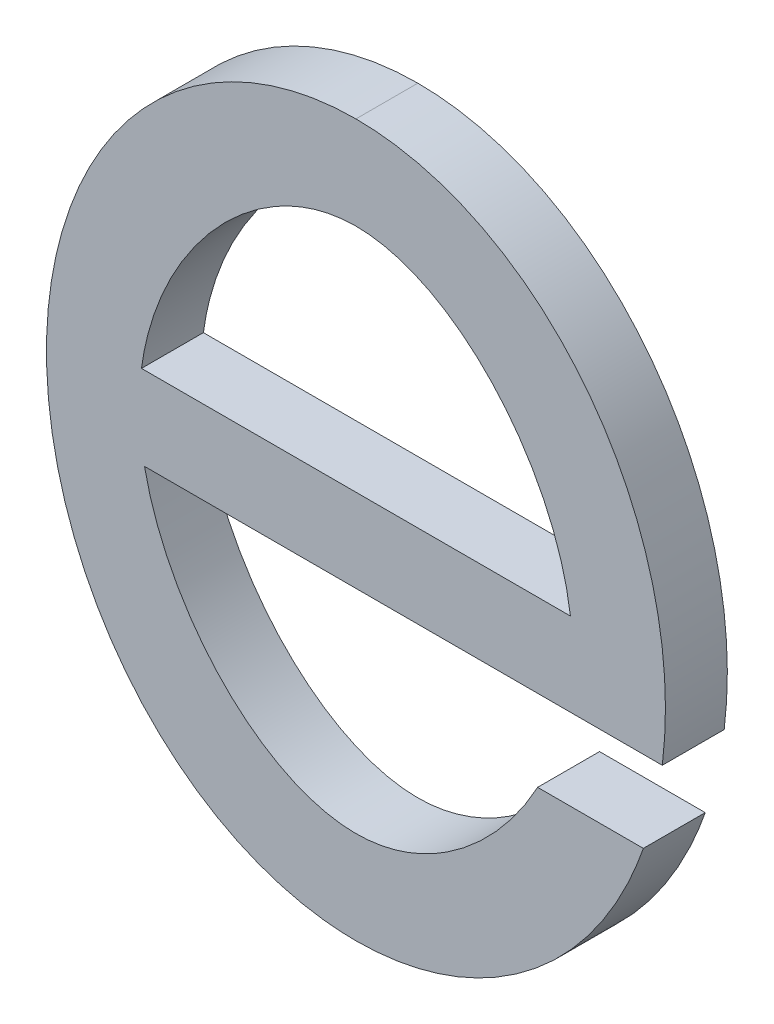
ISO-10303-21;
HEADER;
FILE_DESCRIPTION(('STEP AP214'),'2;1');
FILE_NAME('part.step','',(''),(''),'','','');
FILE_SCHEMA(('AUTOMOTIVE_DESIGN { 1 0 10303 214 1 1 1 1 }'));
ENDSEC;
DATA;
#1=APPLICATION_CONTEXT('core data for automotive mechanical design processes');
#2=APPLICATION_PROTOCOL_DEFINITION('international standard','automotive_design',2000,#1);
#3=PRODUCT_CONTEXT('',#1,'mechanical');
#4=PRODUCT('Part','Part','',(#3));
#5=PRODUCT_RELATED_PRODUCT_CATEGORY('part','',(#4));
#6=PRODUCT_DEFINITION_FORMATION('','',#4);
#7=PRODUCT_DEFINITION_CONTEXT('part definition',#1,'design');
#8=PRODUCT_DEFINITION('design','',#6,#7);
#9=PRODUCT_DEFINITION_SHAPE('','',#8);
#10=(LENGTH_UNIT() NAMED_UNIT(*) SI_UNIT(.MILLI.,.METRE.));
#11=(NAMED_UNIT(*) PLANE_ANGLE_UNIT() SI_UNIT($,.RADIAN.));
#12=(NAMED_UNIT(*) SI_UNIT($,.STERADIAN.) SOLID_ANGLE_UNIT());
#13=UNCERTAINTY_MEASURE_WITH_UNIT(LENGTH_MEASURE(1.E-05),#10,'distance_accuracy_value','');
#14=(GEOMETRIC_REPRESENTATION_CONTEXT(3) GLOBAL_UNCERTAINTY_ASSIGNED_CONTEXT((#13)) GLOBAL_UNIT_ASSIGNED_CONTEXT((#10,
#11,#12)) REPRESENTATION_CONTEXT('',''));
#15=CARTESIAN_POINT('',(0.,0.,0.));
#16=DIRECTION('',(0.,0.,1.));
#17=DIRECTION('',(1.,0.,0.));
#18=AXIS2_PLACEMENT_3D('',#15,#16,#17);
#19=CARTESIAN_POINT('',(0.113744722841676,-0.929281575488683,-0.005));
#20=CARTESIAN_POINT('',(0.113744722841676,-0.929281575488683,0.00499999999999999));
#21=CARTESIAN_POINT('',(0.118408063532346,-0.892031833796241,-0.005));
#22=CARTESIAN_POINT('',(0.118408063532346,-0.892031833796241,0.00499999999999999));
#23=CARTESIAN_POINT('',(0.0969800358251516,-0.863587788073794,-0.005));
#24=CARTESIAN_POINT('',(0.0969800358251516,-0.863587788073794,0.00499999999999999));
#25=CARTESIAN_POINT('',(0.0642549874273535,-0.863587788073793,-0.005));
#26=CARTESIAN_POINT('',(0.0642549874273535,-0.863587788073793,0.00499999999999999));
#27=(BOUNDED_SURFACE() B_SPLINE_SURFACE(3,1,((#19,#20),(#21,#22),(#23,#24),(#25,#26)),
.UNSPECIFIED.,.F.,.F.,.F.) B_SPLINE_SURFACE_WITH_KNOTS((4,4),(2,2),(0.,1.),(0.,1.),
.UNSPECIFIED.) GEOMETRIC_REPRESENTATION_ITEM() RATIONAL_B_SPLINE_SURFACE(((1.,1.),
(0.769859862832912,0.769859862832912),(0.769859862832912,0.769859862832912),(1.,1.))) REPRESENTATION_ITEM('') SURFACE());
#28=CARTESIAN_POINT('',(0.113744722841676,-0.929281575488683,-0.005));
#29=CARTESIAN_POINT('',(0.118408063532346,-0.892031833796241,-0.005));
#30=CARTESIAN_POINT('',(0.0969800358251516,-0.863587788073794,-0.005));
#31=CARTESIAN_POINT('',(0.0642549874273535,-0.863587788073793,-0.005));
#32=(BOUNDED_CURVE() B_SPLINE_CURVE(3,(#28,#29,#30,#31),.UNSPECIFIED.,.F.,
.F.) B_SPLINE_CURVE_WITH_KNOTS((4,4),(1.42780893501642,3.14159265358979),
.UNSPECIFIED.) CURVE() GEOMETRIC_REPRESENTATION_ITEM() RATIONAL_B_SPLINE_CURVE((1.,
0.769859862832912,0.769859862832912,1.)) REPRESENTATION_ITEM(''));
#33=CARTESIAN_POINT('',(0.113744722841676,-0.929281575488683,-0.005));
#34=VERTEX_POINT('',#33);
#35=CARTESIAN_POINT('',(0.0642549874273535,-0.863587788073793,-0.005));
#36=VERTEX_POINT('',#35);
#37=EDGE_CURVE('E11',#34,#36,#32,.T.);
#38=DIRECTION('',(0.,0.,1.));
#39=VECTOR('',#38,1.);
#40=CARTESIAN_POINT('',(0.0642549874273535,-0.863587788073793,-0.005));
#41=LINE('',#40,#39);
#42=CARTESIAN_POINT('',(0.0642549874273535,-0.863587788073793,0.005));
#43=VERTEX_POINT('',#42);
#44=EDGE_CURVE('E28',#36,#43,#41,.T.);
#45=CARTESIAN_POINT('',(0.113744722841676,-0.929281575488683,0.005));
#46=CARTESIAN_POINT('',(0.118408063532346,-0.892031833796241,0.005));
#47=CARTESIAN_POINT('',(0.0969800358251516,-0.863587788073794,0.005));
#48=CARTESIAN_POINT('',(0.0642549874273535,-0.863587788073793,0.005));
#49=(BOUNDED_CURVE() B_SPLINE_CURVE(3,(#45,#46,#47,#48),.UNSPECIFIED.,.F.,
.F.) B_SPLINE_CURVE_WITH_KNOTS((4,4),(1.42780893501642,3.14159265358979),
.UNSPECIFIED.) CURVE() GEOMETRIC_REPRESENTATION_ITEM() RATIONAL_B_SPLINE_CURVE((1.,
0.769859862832912,0.769859862832912,1.)) REPRESENTATION_ITEM(''));
#50=CARTESIAN_POINT('',(0.113744722841676,-0.929281575488683,0.005));
#51=VERTEX_POINT('',#50);
#52=EDGE_CURVE('E185',#51,#43,#49,.T.);
#53=DIRECTION('',(0.,0.,1.));
#54=VECTOR('',#53,1.);
#55=CARTESIAN_POINT('',(0.113744722841676,-0.929281575488683,-0.005));
#56=LINE('',#55,#54);
#57=EDGE_CURVE('E179',#34,#51,#56,.T.);
#58=ORIENTED_EDGE('',*,*,#37,.T.);
#59=ORIENTED_EDGE('',*,*,#44,.T.);
#60=ORIENTED_EDGE('',*,*,#52,.F.);
#61=ORIENTED_EDGE('',*,*,#57,.F.);
#62=EDGE_LOOP('',(#58,#59,#60,#61));
#63=FACE_BOUND('',#62,.T.);
#64=ADVANCED_FACE('F17',(#63),#27,.T.);
#65=CARTESIAN_POINT('',(0.0642549874273535,-0.863587788073793,-0.005));
#66=CARTESIAN_POINT('',(0.0642549874273535,-0.863587788073793,0.00499999999999999));
#67=CARTESIAN_POINT('',(-0.0357450125726465,-0.863587788073793,-0.005));
#68=CARTESIAN_POINT('',(-0.0357450125726465,-0.863587788073793,0.00499999999999999));
#69=CARTESIAN_POINT('',(-0.0357450125726465,-0.978587788073793,-0.005));
#70=CARTESIAN_POINT('',(-0.0357450125726465,-0.978587788073793,0.00499999999999999));
#71=CARTESIAN_POINT('',(0.0642549874273535,-0.978587788073793,-0.005));
#72=CARTESIAN_POINT('',(0.0642549874273535,-0.978587788073793,0.00499999999999999));
#73=(BOUNDED_SURFACE() B_SPLINE_SURFACE(3,1,((#65,#66),(#67,#68),(#69,#70),(#71,#72)),
.UNSPECIFIED.,.F.,.F.,.F.) B_SPLINE_SURFACE_WITH_KNOTS((4,4),(2,2),(0.,1.),(0.,1.),
.UNSPECIFIED.) GEOMETRIC_REPRESENTATION_ITEM() RATIONAL_B_SPLINE_SURFACE(((1.,1.),
(0.333333333333333,0.333333333333333),(0.333333333333333,0.333333333333333),(1.,1.))) REPRESENTATION_ITEM('') SURFACE());
#74=CARTESIAN_POINT('',(0.0642549874273535,-0.863587788073793,-0.005));
#75=CARTESIAN_POINT('',(-0.0357450125726465,-0.863587788073793,-0.005));
#76=CARTESIAN_POINT('',(-0.0357450125726465,-0.978587788073793,-0.005));
#77=CARTESIAN_POINT('',(0.0642549874273535,-0.978587788073793,-0.005));
#78=(BOUNDED_CURVE() B_SPLINE_CURVE(3,(#74,#75,#76,#77),.UNSPECIFIED.,.F.,
.F.) B_SPLINE_CURVE_WITH_KNOTS((4,4),(3.14159265358979,6.28318530717959),
.UNSPECIFIED.) CURVE() GEOMETRIC_REPRESENTATION_ITEM() RATIONAL_B_SPLINE_CURVE((1.,
0.333333333333333,0.333333333333333,1.)) REPRESENTATION_ITEM(''));
#79=CARTESIAN_POINT('',(0.0642549874273535,-0.978587788073793,-0.005));
#80=VERTEX_POINT('',#79);
#81=EDGE_CURVE('E175',#36,#80,#78,.T.);
#82=DIRECTION('',(0.,0.,1.));
#83=VECTOR('',#82,1.);
#84=CARTESIAN_POINT('',(0.0642549874273535,-0.978587788073793,-0.005));
#85=LINE('',#84,#83);
#86=CARTESIAN_POINT('',(0.0642549874273535,-0.978587788073793,0.005));
#87=VERTEX_POINT('',#86);
#88=EDGE_CURVE('E170',#80,#87,#85,.T.);
#89=CARTESIAN_POINT('',(0.0642549874273535,-0.863587788073793,0.005));
#90=CARTESIAN_POINT('',(-0.0357450125726465,-0.863587788073793,0.005));
#91=CARTESIAN_POINT('',(-0.0357450125726465,-0.978587788073793,0.005));
#92=CARTESIAN_POINT('',(0.0642549874273535,-0.978587788073793,0.005));
#93=(BOUNDED_CURVE() B_SPLINE_CURVE(3,(#89,#90,#91,#92),.UNSPECIFIED.,.F.,
.F.) B_SPLINE_CURVE_WITH_KNOTS((4,4),(3.14159265358979,6.28318530717959),
.UNSPECIFIED.) CURVE() GEOMETRIC_REPRESENTATION_ITEM() RATIONAL_B_SPLINE_CURVE((1.,
0.333333333333333,0.333333333333333,1.)) REPRESENTATION_ITEM(''));
#94=EDGE_CURVE('E165',#43,#87,#93,.T.);
#95=ORIENTED_EDGE('',*,*,#44,.F.);
#96=ORIENTED_EDGE('',*,*,#81,.T.);
#97=ORIENTED_EDGE('',*,*,#88,.T.);
#98=ORIENTED_EDGE('',*,*,#94,.F.);
#99=EDGE_LOOP('',(#95,#96,#97,#98));
#100=FACE_BOUND('',#99,.T.);
#101=ADVANCED_FACE('F198',(#100),#73,.T.);
#102=CARTESIAN_POINT('',(0.0300942344015667,-0.929281575488683,-0.005));
#103=CARTESIAN_POINT('',(0.0300942344015667,-0.929281575488683,0.00499999999999999));
#104=CARTESIAN_POINT('',(0.0337787104072709,-0.947475923214032,-0.005));
#105=CARTESIAN_POINT('',(0.0337787104072709,-0.947475923214032,0.00499999999999999));
#106=CARTESIAN_POINT('',(0.0490168494171269,-0.963587821043513,-0.005));
#107=CARTESIAN_POINT('',(0.0490168494171269,-0.963587821043513,0.00499999999999999));
#108=CARTESIAN_POINT('',(0.0642549884269829,-0.963587821043513,-0.005));
#109=CARTESIAN_POINT('',(0.0642549884269829,-0.963587821043513,0.00499999999999999));
#110=CARTESIAN_POINT('',(0.0756477962366248,-0.963587821043513,-0.005));
#111=CARTESIAN_POINT('',(0.0756477962366248,-0.963587821043513,0.00499999999999999));
#112=CARTESIAN_POINT('',(0.0870406040462668,-0.954581563139895,-0.005));
#113=CARTESIAN_POINT('',(0.0870406040462668,-0.954581563139895,0.00499999999999999));
#114=CARTESIAN_POINT('',(0.0936048676027327,-0.942432279640087,-0.005));
#115=CARTESIAN_POINT('',(0.0936048676027327,-0.942432279640087,0.00499999999999999));
#116=B_SPLINE_SURFACE_WITH_KNOTS('',3,1,((#102,#103),(#104,#105),(#106,#107),(#108,#109),(#110,
#111),(#112,#113),(#114,#115)),.UNSPECIFIED.,.F.,.F.,.F.,(4,3,4),(2,2),(4.9154131481012,
6.28318530717959,7.30580134485192),(0.,1.),.UNSPECIFIED.);
#117=DIRECTION('',(0.,0.,1.));
#118=VECTOR('',#117,1.);
#119=CARTESIAN_POINT('',(0.0300942344015667,-0.929281575488683,-0.005));
#120=LINE('',#119,#118);
#121=CARTESIAN_POINT('',(0.0300942344015667,-0.929281575488683,-0.005));
#122=VERTEX_POINT('',#121);
#123=CARTESIAN_POINT('',(0.0300942344015667,-0.929281575488683,0.005));
#124=VERTEX_POINT('',#123);
#125=EDGE_CURVE('E159',#122,#124,#120,.T.);
#126=CARTESIAN_POINT('',(0.0300942344015667,-0.929281575488683,0.005));
#127=CARTESIAN_POINT('',(0.0337787104072709,-0.947475923214032,0.005));
#128=CARTESIAN_POINT('',(0.0490168494171269,-0.963587821043513,0.005));
#129=CARTESIAN_POINT('',(0.0642549884269829,-0.963587821043513,0.005));
#130=CARTESIAN_POINT('',(0.0756477962366248,-0.963587821043513,0.005));
#131=CARTESIAN_POINT('',(0.0870406040462668,-0.954581563139895,0.005));
#132=CARTESIAN_POINT('',(0.0936048676027327,-0.942432279640086,0.005));
#133=B_SPLINE_CURVE_WITH_KNOTS('',3,(#126,#127,#128,#129,#130,#131,#132),.UNSPECIFIED.,.F.,.F.,
(4,3,4),(4.9154131481012,6.28318530717959,7.30580134485192),.UNSPECIFIED.);
#134=CARTESIAN_POINT('',(0.0936048676027327,-0.942432279640086,0.005));
#135=VERTEX_POINT('',#134);
#136=EDGE_CURVE('E154',#124,#135,#133,.T.);
#137=DIRECTION('',(0.,0.,1.));
#138=VECTOR('',#137,1.);
#139=CARTESIAN_POINT('',(0.0936048676027327,-0.942432279640086,-0.005));
#140=LINE('',#139,#138);
#141=CARTESIAN_POINT('',(0.0936048676027327,-0.942432279640086,-0.005));
#142=VERTEX_POINT('',#141);
#143=EDGE_CURVE('E149',#142,#135,#140,.T.);
#144=CARTESIAN_POINT('',(0.0300942344015667,-0.929281575488683,-0.005));
#145=CARTESIAN_POINT('',(0.0337787104072709,-0.947475923214032,-0.005));
#146=CARTESIAN_POINT('',(0.0490168494171269,-0.963587821043513,-0.005));
#147=CARTESIAN_POINT('',(0.0642549884269829,-0.963587821043513,-0.005));
#148=CARTESIAN_POINT('',(0.0756477962366248,-0.963587821043513,-0.005));
#149=CARTESIAN_POINT('',(0.0870406040462668,-0.954581563139895,-0.005));
#150=CARTESIAN_POINT('',(0.0936048676027327,-0.942432279640086,-0.005));
#151=B_SPLINE_CURVE_WITH_KNOTS('',3,(#144,#145,#146,#147,#148,#149,#150),.UNSPECIFIED.,.F.,.F.,
(4,3,4),(4.9154131481012,6.28318530717959,7.30580134485192),.UNSPECIFIED.);
#152=EDGE_CURVE('E145',#122,#142,#151,.T.);
#153=ORIENTED_EDGE('',*,*,#125,.T.);
#154=ORIENTED_EDGE('',*,*,#136,.T.);
#155=ORIENTED_EDGE('',*,*,#143,.F.);
#156=ORIENTED_EDGE('',*,*,#152,.F.);
#157=EDGE_LOOP('',(#153,#154,#155,#156));
#158=FACE_BOUND('',#157,.T.);
#159=ADVANCED_FACE('F210',(#158),#116,.F.);
#160=CARTESIAN_POINT('',(-4.60051070012874E-08,-0.942432275070735,-0.005));
#161=DIRECTION('',(-4.88152923220232E-08,-0.999999999999999,0.));
#162=DIRECTION('',(0.999999999999999,-4.88152923220232E-08,0.));
#163=AXIS2_PLACEMENT_3D('',#160,#161,#162);
#164=PLANE('',#163);
#165=ORIENTED_EDGE('',*,*,#143,.T.);
#166=DIRECTION('',(0.999999999999999,-4.88152923220232E-08,0.));
#167=VECTOR('',#166,1.);
#168=CARTESIAN_POINT('',(-4.60051070012874E-08,-0.942432275070735,0.005));
#169=LINE('',#168,#167);
#170=CARTESIAN_POINT('',(0.110682463193358,-0.942432280473734,0.005));
#171=VERTEX_POINT('',#170);
#172=EDGE_CURVE('E143',#135,#171,#169,.T.);
#173=ORIENTED_EDGE('',*,*,#172,.T.);
#174=DIRECTION('',(0.,0.,1.));
#175=VECTOR('',#174,1.);
#176=CARTESIAN_POINT('',(0.110682463193358,-0.942432280473734,-0.005));
#177=LINE('',#176,#175);
#178=CARTESIAN_POINT('',(0.110682463193358,-0.942432280473734,-0.005));
#179=VERTEX_POINT('',#178);
#180=EDGE_CURVE('E140',#179,#171,#177,.T.);
#181=ORIENTED_EDGE('',*,*,#180,.F.);
#182=DIRECTION('',(0.999999999999999,-4.88152923220232E-08,0.));
#183=VECTOR('',#182,1.);
#184=CARTESIAN_POINT('',(-4.60051070012874E-08,-0.942432275070735,-0.005));
#185=LINE('',#184,#183);
#186=EDGE_CURVE('E134',#142,#179,#185,.T.);
#187=ORIENTED_EDGE('',*,*,#186,.F.);
#188=EDGE_LOOP('',(#165,#173,#181,#187));
#189=FACE_BOUND('',#188,.T.);
#190=ADVANCED_FACE('F206',(#189),#164,.F.);
#191=CARTESIAN_POINT('',(0.0642549874273535,-0.978587788073793,-0.005));
#192=CARTESIAN_POINT('',(0.0642549874273535,-0.978587788073793,0.00499999999999999));
#193=CARTESIAN_POINT('',(0.0853658624871588,-0.978587788073793,-0.005));
#194=CARTESIAN_POINT('',(0.0853658624871588,-0.978587788073793,0.00499999999999999));
#195=CARTESIAN_POINT('',(0.10284592558866,-0.964975147199214,-0.005));
#196=CARTESIAN_POINT('',(0.10284592558866,-0.964975147199214,0.00499999999999999));
#197=CARTESIAN_POINT('',(0.110682463193358,-0.942432280473734,-0.005));
#198=CARTESIAN_POINT('',(0.110682463193358,-0.942432280473734,0.00499999999999999));
#199=(BOUNDED_SURFACE() B_SPLINE_SURFACE(3,1,((#191,#192),(#193,#194),(#195,#196),(#197,#198)),
.UNSPECIFIED.,.F.,.F.,.F.) B_SPLINE_SURFACE_WITH_KNOTS((4,4),(2,2),(0.,1.),(0.,1.),
.UNSPECIFIED.) GEOMETRIC_REPRESENTATION_ITEM() RATIONAL_B_SPLINE_SURFACE(((1.,1.),
(0.885341498224082,0.885341498224082),(0.885341498224082,0.885341498224082),(1.,1.))) REPRESENTATION_ITEM('') SURFACE());
#200=CARTESIAN_POINT('',(0.0642549874273535,-0.978587788073793,-0.005));
#201=CARTESIAN_POINT('',(0.0853658624871588,-0.978587788073793,-0.005));
#202=CARTESIAN_POINT('',(0.10284592558866,-0.964975147199214,-0.005));
#203=CARTESIAN_POINT('',(0.110682463193358,-0.942432280473734,-0.005));
#204=(BOUNDED_CURVE() B_SPLINE_CURVE(3,(#200,#201,#202,#203),.UNSPECIFIED.,.F.,
.F.) B_SPLINE_CURVE_WITH_KNOTS((4,4),(0.,1.19048608356118),
.UNSPECIFIED.) CURVE() GEOMETRIC_REPRESENTATION_ITEM() RATIONAL_B_SPLINE_CURVE((1.,
0.885341498224082,0.885341498224082,1.)) REPRESENTATION_ITEM(''));
#205=EDGE_CURVE('E126',#80,#179,#204,.T.);
#206=CARTESIAN_POINT('',(0.0642549874273535,-0.978587788073793,0.005));
#207=CARTESIAN_POINT('',(0.0853658624871588,-0.978587788073793,0.005));
#208=CARTESIAN_POINT('',(0.10284592558866,-0.964975147199214,0.005));
#209=CARTESIAN_POINT('',(0.110682463193358,-0.942432280473734,0.005));
#210=(BOUNDED_CURVE() B_SPLINE_CURVE(3,(#206,#207,#208,#209),.UNSPECIFIED.,.F.,
.F.) B_SPLINE_CURVE_WITH_KNOTS((4,4),(0.,1.19048608356118),
.UNSPECIFIED.) CURVE() GEOMETRIC_REPRESENTATION_ITEM() RATIONAL_B_SPLINE_CURVE((1.,
0.885341498224082,0.885341498224082,1.)) REPRESENTATION_ITEM(''));
#211=EDGE_CURVE('E121',#87,#171,#210,.T.);
#212=ORIENTED_EDGE('',*,*,#88,.F.);
#213=ORIENTED_EDGE('',*,*,#205,.T.);
#214=ORIENTED_EDGE('',*,*,#180,.T.);
#215=ORIENTED_EDGE('',*,*,#211,.F.);
#216=EDGE_LOOP('',(#212,#213,#214,#215));
#217=FACE_BOUND('',#216,.T.);
#218=ADVANCED_FACE('F202',(#217),#199,.T.);
#219=CARTESIAN_POINT('',(0.0989044209183929,-0.915818667218718,-0.005));
#220=CARTESIAN_POINT('',(0.0989044209183929,-0.915818667218718,0.00499999999999999));
#221=CARTESIAN_POINT('',(0.0963545962750532,-0.896463453892754,-0.005));
#222=CARTESIAN_POINT('',(0.0963545962750532,-0.896463453892754,0.00499999999999999));
#223=CARTESIAN_POINT('',(0.0642549881816173,-0.860715408435637,-0.005));
#224=CARTESIAN_POINT('',(0.0642549881816173,-0.860715408435637,0.00499999999999999));
#225=CARTESIAN_POINT('',(0.0321553800910871,-0.896463453893629,-0.005));
#226=CARTESIAN_POINT('',(0.0321553800910871,-0.896463453893629,0.00499999999999999));
#227=CARTESIAN_POINT('',(0.0296055554481349,-0.915818667218718,-0.005));
#228=CARTESIAN_POINT('',(0.0296055554481349,-0.915818667218718,0.00499999999999999));
#229=B_SPLINE_SURFACE_WITH_KNOTS('',3,1,((#219,#220),(#221,#222),(#223,#224),(#225,#226),(#227,
#228)),.UNSPECIFIED.,.F.,.F.,.F.,(4,1,4),(2,2),(7.98415091837894,9.42477796076938,
10.86540500309),(0.,1.),.UNSPECIFIED.);
#230=DIRECTION('',(0.,0.,1.));
#231=VECTOR('',#230,1.);
#232=CARTESIAN_POINT('',(0.0989044209183929,-0.915818667218718,-0.005));
#233=LINE('',#232,#231);
#234=CARTESIAN_POINT('',(0.0989044209183929,-0.915818667218718,-0.005));
#235=VERTEX_POINT('',#234);
#236=CARTESIAN_POINT('',(0.0989044209183929,-0.915818667218718,0.005));
#237=VERTEX_POINT('',#236);
#238=EDGE_CURVE('E100',#235,#237,#233,.T.);
#239=CARTESIAN_POINT('',(0.0989044209183929,-0.915818667218718,0.005));
#240=CARTESIAN_POINT('',(0.0963545962750532,-0.896463453892754,0.005));
#241=CARTESIAN_POINT('',(0.0642549881816173,-0.860715408435637,0.005));
#242=CARTESIAN_POINT('',(0.0321553800910871,-0.896463453893629,0.005));
#243=CARTESIAN_POINT('',(0.0296055554481349,-0.915818667218718,0.005));
#244=B_SPLINE_CURVE_WITH_KNOTS('',3,(#239,#240,#241,#242,#243),.UNSPECIFIED.,.F.,.F.,(4,1,4),
(7.98415091837894,9.42477796076938,10.86540500309),.UNSPECIFIED.);
#245=CARTESIAN_POINT('',(0.0296055554481349,-0.915818667218718,0.005));
#246=VERTEX_POINT('',#245);
#247=EDGE_CURVE('E94',#237,#246,#244,.T.);
#248=DIRECTION('',(0.,0.,1.));
#249=VECTOR('',#248,1.);
#250=CARTESIAN_POINT('',(0.0296055554481349,-0.915818667218718,-0.005));
#251=LINE('',#250,#249);
#252=CARTESIAN_POINT('',(0.0296055554481349,-0.915818667218718,-0.005));
#253=VERTEX_POINT('',#252);
#254=EDGE_CURVE('E89',#253,#246,#251,.T.);
#255=CARTESIAN_POINT('',(0.0989044209183929,-0.915818667218718,-0.005));
#256=CARTESIAN_POINT('',(0.0963545962750532,-0.896463453892754,-0.005));
#257=CARTESIAN_POINT('',(0.0642549881816173,-0.860715408435637,-0.005));
#258=CARTESIAN_POINT('',(0.0321553800910871,-0.896463453893629,-0.005));
#259=CARTESIAN_POINT('',(0.0296055554481349,-0.915818667218718,-0.005));
#260=B_SPLINE_CURVE_WITH_KNOTS('',3,(#255,#256,#257,#258,#259),.UNSPECIFIED.,.F.,.F.,(4,1,4),
(7.98415091837894,9.42477796076938,10.86540500309),.UNSPECIFIED.);
#261=EDGE_CURVE('E81',#235,#253,#260,.T.);
#262=ORIENTED_EDGE('',*,*,#238,.T.);
#263=ORIENTED_EDGE('',*,*,#247,.T.);
#264=ORIENTED_EDGE('',*,*,#254,.F.);
#265=ORIENTED_EDGE('',*,*,#261,.F.);
#266=EDGE_LOOP('',(#262,#263,#264,#265));
#267=FACE_BOUND('',#266,.T.);
#268=ADVANCED_FACE('F93',(#267),#229,.F.);
#269=CARTESIAN_POINT('',(0.,-0.915818667218718,-0.005));
#270=DIRECTION('',(0.,-1.,0.));
#271=DIRECTION('',(0.,0.,-1.));
#272=AXIS2_PLACEMENT_3D('',#269,#270,#271);
#273=PLANE('',#272);
#274=ORIENTED_EDGE('',*,*,#254,.T.);
#275=DIRECTION('',(1.,0.,0.));
#276=VECTOR('',#275,1.);
#277=CARTESIAN_POINT('',(0.,-0.915818667218718,0.005));
#278=LINE('',#277,#276);
#279=EDGE_CURVE('E90',#246,#237,#278,.T.);
#280=ORIENTED_EDGE('',*,*,#279,.T.);
#281=ORIENTED_EDGE('',*,*,#238,.F.);
#282=DIRECTION('',(1.,0.,0.));
#283=VECTOR('',#282,1.);
#284=CARTESIAN_POINT('',(0.,-0.915818667218718,-0.005));
#285=LINE('',#284,#283);
#286=EDGE_CURVE('E85',#253,#235,#285,.T.);
#287=ORIENTED_EDGE('',*,*,#286,.F.);
#288=EDGE_LOOP('',(#274,#280,#281,#287));
#289=FACE_BOUND('',#288,.T.);
#290=ADVANCED_FACE('F99',(#289),#273,.F.);
#291=CARTESIAN_POINT('',(0.,-0.929281575488683,-0.005));
#292=DIRECTION('',(0.,-1.,0.));
#293=DIRECTION('',(0.,0.,-1.));
#294=AXIS2_PLACEMENT_3D('',#291,#292,#293);
#295=PLANE('',#294);
#296=ORIENTED_EDGE('',*,*,#57,.T.);
#297=DIRECTION('',(1.,0.,0.));
#298=VECTOR('',#297,1.);
#299=CARTESIAN_POINT('',(0.,-0.929281575488683,0.005));
#300=LINE('',#299,#298);
#301=EDGE_CURVE('E101',#124,#51,#300,.T.);
#302=ORIENTED_EDGE('',*,*,#301,.F.);
#303=ORIENTED_EDGE('',*,*,#125,.F.);
#304=DIRECTION('',(1.,0.,0.));
#305=VECTOR('',#304,1.);
#306=CARTESIAN_POINT('',(0.,-0.929281575488683,-0.005));
#307=LINE('',#306,#305);
#308=EDGE_CURVE('E105',#122,#34,#307,.T.);
#309=ORIENTED_EDGE('',*,*,#308,.T.);
#310=EDGE_LOOP('',(#296,#302,#303,#309));
#311=FACE_BOUND('',#310,.T.);
#312=ADVANCED_FACE('F213',(#311),#295,.T.);
#313=CARTESIAN_POINT('',(0.,0.,-0.005));
#314=DIRECTION('',(0.,0.,1.));
#315=DIRECTION('',(1.,0.,0.));
#316=AXIS2_PLACEMENT_3D('',#313,#314,#315);
#317=PLANE('',#316);
#318=ORIENTED_EDGE('',*,*,#261,.T.);
#319=ORIENTED_EDGE('',*,*,#286,.T.);
#320=EDGE_LOOP('',(#318,#319));
#321=FACE_BOUND('',#320,.T.);
#322=ORIENTED_EDGE('',*,*,#152,.T.);
#323=ORIENTED_EDGE('',*,*,#186,.T.);
#324=ORIENTED_EDGE('',*,*,#205,.F.);
#325=ORIENTED_EDGE('',*,*,#81,.F.);
#326=ORIENTED_EDGE('',*,*,#37,.F.);
#327=ORIENTED_EDGE('',*,*,#308,.F.);
#328=EDGE_LOOP('',(#322,#323,#324,#325,#326,#327));
#329=FACE_BOUND('',#328,.T.);
#330=ADVANCED_FACE('F83',(#321,#329),#317,.F.);
#331=CARTESIAN_POINT('',(0.,0.,0.005));
#332=DIRECTION('',(0.,0.,1.));
#333=DIRECTION('',(1.,0.,0.));
#334=AXIS2_PLACEMENT_3D('',#331,#332,#333);
#335=PLANE('',#334);
#336=ORIENTED_EDGE('',*,*,#247,.F.);
#337=ORIENTED_EDGE('',*,*,#279,.F.);
#338=EDGE_LOOP('',(#336,#337));
#339=FACE_BOUND('',#338,.T.);
#340=ORIENTED_EDGE('',*,*,#136,.F.);
#341=ORIENTED_EDGE('',*,*,#301,.T.);
#342=ORIENTED_EDGE('',*,*,#52,.T.);
#343=ORIENTED_EDGE('',*,*,#94,.T.);
#344=ORIENTED_EDGE('',*,*,#211,.T.);
#345=ORIENTED_EDGE('',*,*,#172,.F.);
#346=EDGE_LOOP('',(#340,#341,#342,#343,#344,#345));
#347=FACE_BOUND('',#346,.T.);
#348=ADVANCED_FACE('F195',(#339,#347),#335,.T.);
#349=CLOSED_SHELL('',(#64,#101,#159,#190,#218,#268,#290,#312,#330,#348));
#350=MANIFOLD_SOLID_BREP('B1',#349);
#351=ADVANCED_BREP_SHAPE_REPRESENTATION('',(#18,#350),#14);
#352=SHAPE_DEFINITION_REPRESENTATION(#9,#351);
ENDSEC;
END-ISO-10303-21;
